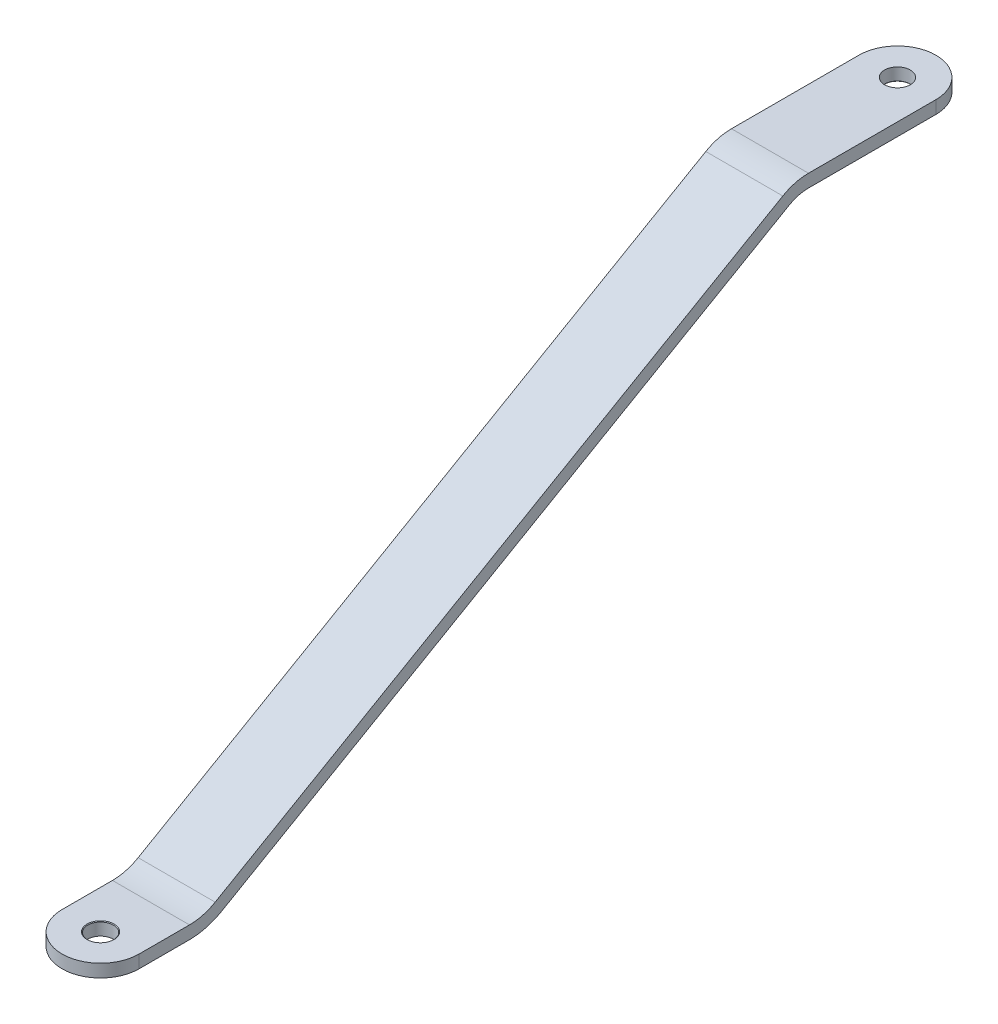
ISO-10303-21;
HEADER;
FILE_DESCRIPTION(('STEP AP214'),'2;1');
FILE_NAME('part.step','',(''),(''),'','','');
FILE_SCHEMA(('AUTOMOTIVE_DESIGN { 1 0 10303 214 1 1 1 1 }'));
ENDSEC;
DATA;
#1=APPLICATION_CONTEXT('core data for automotive mechanical design processes');
#2=APPLICATION_PROTOCOL_DEFINITION('international standard','automotive_design',2000,#1);
#3=PRODUCT_CONTEXT('',#1,'mechanical');
#4=PRODUCT('Part','Part','',(#3));
#5=PRODUCT_RELATED_PRODUCT_CATEGORY('part','',(#4));
#6=PRODUCT_DEFINITION_FORMATION('','',#4);
#7=PRODUCT_DEFINITION_CONTEXT('part definition',#1,'design');
#8=PRODUCT_DEFINITION('design','',#6,#7);
#9=PRODUCT_DEFINITION_SHAPE('','',#8);
#10=(LENGTH_UNIT() NAMED_UNIT(*) SI_UNIT(.MILLI.,.METRE.));
#11=(NAMED_UNIT(*) PLANE_ANGLE_UNIT() SI_UNIT($,.RADIAN.));
#12=(NAMED_UNIT(*) SI_UNIT($,.STERADIAN.) SOLID_ANGLE_UNIT());
#13=UNCERTAINTY_MEASURE_WITH_UNIT(LENGTH_MEASURE(1.E-05),#10,'distance_accuracy_value','');
#14=(GEOMETRIC_REPRESENTATION_CONTEXT(3) GLOBAL_UNCERTAINTY_ASSIGNED_CONTEXT((#13)) GLOBAL_UNIT_ASSIGNED_CONTEXT((#10,
#11,#12)) REPRESENTATION_CONTEXT('',''));
#15=CARTESIAN_POINT('',(0.,0.,0.));
#16=DIRECTION('',(0.,0.,1.));
#17=DIRECTION('',(1.,0.,0.));
#18=AXIS2_PLACEMENT_3D('',#15,#16,#17);
#19=CARTESIAN_POINT('',(76.2,0.,394.160701906459));
#20=DIRECTION('',(0.,-1.,0.));
#21=DIRECTION('',(0.,0.,-1.));
#22=AXIS2_PLACEMENT_3D('',#19,#20,#21);
#23=PLANE('',#22);
#24=DIRECTION('',(0.,0.,1.));
#25=VECTOR('',#24,1.);
#26=CARTESIAN_POINT('',(0.,0.,394.160701906459));
#27=LINE('',#26,#25);
#28=CARTESIAN_POINT('',(0.,0.,306.17252088196));
#29=VERTEX_POINT('',#28);
#30=CARTESIAN_POINT('',(0.,0.,356.060701906459));
#31=VERTEX_POINT('',#30);
#32=EDGE_CURVE('E138',#29,#31,#27,.T.);
#33=ORIENTED_EDGE('',*,*,#32,.T.);
#34=CARTESIAN_POINT('',(38.1,0.,356.060701906459));
#35=DIRECTION('',(0.,-1.,0.));
#36=DIRECTION('',(0.,0.,-1.));
#37=AXIS2_PLACEMENT_3D('',#34,#35,#36);
#38=CIRCLE('',#37,38.1);
#39=CARTESIAN_POINT('',(76.2,0.,356.060701906459));
#40=VERTEX_POINT('',#39);
#41=EDGE_CURVE('E216',#31,#40,#38,.F.);
#42=ORIENTED_EDGE('',*,*,#41,.T.);
#43=DIRECTION('',(0.,0.,1.));
#44=VECTOR('',#43,1.);
#45=CARTESIAN_POINT('',(76.2,0.,394.160701906459));
#46=LINE('',#45,#44);
#47=CARTESIAN_POINT('',(76.2,0.,306.17252088196));
#48=VERTEX_POINT('',#47);
#49=EDGE_CURVE('E173',#48,#40,#46,.T.);
#50=ORIENTED_EDGE('',*,*,#49,.F.);
#51=DIRECTION('',(-1.,0.,0.));
#52=VECTOR('',#51,1.);
#53=CARTESIAN_POINT('',(76.2,0.,306.17252088196));
#54=LINE('',#53,#52);
#55=EDGE_CURVE('E172',#48,#29,#54,.T.);
#56=ORIENTED_EDGE('',*,*,#55,.T.);
#57=EDGE_LOOP('',(#33,#42,#50,#56));
#58=FACE_BOUND('',#57,.T.);
#59=CARTESIAN_POINT('',(38.1,-1.27520573627798E-13,356.060701906459));
#60=DIRECTION('',(0.,1.,0.));
#61=DIRECTION('',(0.,0.,1.));
#62=AXIS2_PLACEMENT_3D('',#59,#60,#61);
#63=CIRCLE('',#62,13.335);
#64=CARTESIAN_POINT('',(38.1,-1.32231439788521E-13,369.395701906459));
#65=VERTEX_POINT('',#64);
#66=EDGE_CURVE('E301',#65,#65,#63,.T.);
#67=ORIENTED_EDGE('',*,*,#66,.F.);
#68=EDGE_LOOP('',(#67));
#69=FACE_BOUND('',#68,.T.);
#70=ADVANCED_FACE('F41',(#58,#69),#23,.F.);
#71=CARTESIAN_POINT('',(38.1,337.820000000001,-432.260701906459));
#72=DIRECTION('',(0.,1.,0.));
#73=DIRECTION('',(0.,0.,1.));
#74=AXIS2_PLACEMENT_3D('',#71,#72,#73);
#75=CYLINDRICAL_SURFACE('',#74,38.1);
#76=DIRECTION('',(0.,1.,0.));
#77=VECTOR('',#76,1.);
#78=CARTESIAN_POINT('',(0.,50.8,-432.260701906459));
#79=LINE('',#78,#77);
#80=CARTESIAN_POINT('',(0.,337.820000000001,-432.260701906459));
#81=VERTEX_POINT('',#80);
#82=CARTESIAN_POINT('',(0.,325.120000000001,-432.260701906459));
#83=VERTEX_POINT('',#82);
#84=EDGE_CURVE('E219',#81,#83,#79,.F.);
#85=ORIENTED_EDGE('',*,*,#84,.F.);
#86=CARTESIAN_POINT('',(38.1,337.820000000001,-432.260701906459));
#87=DIRECTION('',(0.,-1.,0.));
#88=DIRECTION('',(0.,0.,-1.));
#89=AXIS2_PLACEMENT_3D('',#86,#87,#88);
#90=CIRCLE('',#89,38.1);
#91=CARTESIAN_POINT('',(76.2,337.820000000001,-432.260701906459));
#92=VERTEX_POINT('',#91);
#93=EDGE_CURVE('E49',#92,#81,#90,.F.);
#94=ORIENTED_EDGE('',*,*,#93,.F.);
#95=DIRECTION('',(0.,-1.,0.));
#96=VECTOR('',#95,1.);
#97=CARTESIAN_POINT('',(76.2,337.820000000001,-432.260701906459));
#98=LINE('',#97,#96);
#99=CARTESIAN_POINT('',(76.2,325.120000000001,-432.260701906459));
#100=VERTEX_POINT('',#99);
#101=EDGE_CURVE('E224',#100,#92,#98,.F.);
#102=ORIENTED_EDGE('',*,*,#101,.F.);
#103=CARTESIAN_POINT('',(38.1,325.120000000001,-432.260701906459));
#104=DIRECTION('',(0.,1.,0.));
#105=DIRECTION('',(0.,0.,1.));
#106=AXIS2_PLACEMENT_3D('',#103,#104,#105);
#107=CIRCLE('',#106,38.1);
#108=EDGE_CURVE('E11',#83,#100,#107,.F.);
#109=ORIENTED_EDGE('',*,*,#108,.F.);
#110=EDGE_LOOP('',(#85,#94,#102,#109));
#111=FACE_BOUND('',#110,.T.);
#112=ADVANCED_FACE('F42',(#111),#75,.T.);
#113=CARTESIAN_POINT('',(38.1,0.,356.060701906459));
#114=DIRECTION('',(0.,-1.,0.));
#115=DIRECTION('',(0.,0.,-1.));
#116=AXIS2_PLACEMENT_3D('',#113,#114,#115);
#117=CYLINDRICAL_SURFACE('',#116,38.1);
#118=DIRECTION('',(0.,1.,0.));
#119=VECTOR('',#118,1.);
#120=CARTESIAN_POINT('',(76.2,0.,356.060701906459));
#121=LINE('',#120,#119);
#122=CARTESIAN_POINT('',(76.2,-12.7,356.060701906459));
#123=VERTEX_POINT('',#122);
#124=EDGE_CURVE('E139',#40,#123,#121,.F.);
#125=ORIENTED_EDGE('',*,*,#124,.F.);
#126=ORIENTED_EDGE('',*,*,#41,.F.);
#127=DIRECTION('',(0.,-1.,0.));
#128=VECTOR('',#127,1.);
#129=CARTESIAN_POINT('',(0.,50.8,356.060701906459));
#130=LINE('',#129,#128);
#131=CARTESIAN_POINT('',(0.,-12.7,356.060701906459));
#132=VERTEX_POINT('',#131);
#133=EDGE_CURVE('E213',#132,#31,#130,.F.);
#134=ORIENTED_EDGE('',*,*,#133,.F.);
#135=CARTESIAN_POINT('',(38.1,-12.7,356.060701906459));
#136=DIRECTION('',(0.,1.,0.));
#137=DIRECTION('',(0.,0.,1.));
#138=AXIS2_PLACEMENT_3D('',#135,#136,#137);
#139=CIRCLE('',#138,38.1);
#140=EDGE_CURVE('E217',#123,#132,#139,.F.);
#141=ORIENTED_EDGE('',*,*,#140,.F.);
#142=EDGE_LOOP('',(#125,#126,#134,#141));
#143=FACE_BOUND('',#142,.T.);
#144=ADVANCED_FACE('F271',(#143),#117,.T.);
#145=CARTESIAN_POINT('',(76.2,-12.7,394.160701906459));
#146=DIRECTION('',(0.,1.,0.));
#147=DIRECTION('',(0.,0.,1.));
#148=AXIS2_PLACEMENT_3D('',#145,#146,#147);
#149=PLANE('',#148);
#150=CARTESIAN_POINT('',(38.1,-12.7000000000002,356.060701906459));
#151=DIRECTION('',(0.,1.,0.));
#152=DIRECTION('',(0.,0.,1.));
#153=AXIS2_PLACEMENT_3D('',#150,#151,#152);
#154=CIRCLE('',#153,12.7);
#155=CARTESIAN_POINT('',(38.1,-12.7000000000003,368.760701906459));
#156=VERTEX_POINT('',#155);
#157=EDGE_CURVE('E177',#156,#156,#154,.T.);
#158=ORIENTED_EDGE('',*,*,#157,.T.);
#159=EDGE_LOOP('',(#158));
#160=FACE_BOUND('',#159,.T.);
#161=DIRECTION('',(0.,0.,-1.));
#162=VECTOR('',#161,1.);
#163=CARTESIAN_POINT('',(76.2,-12.7,394.160701906459));
#164=LINE('',#163,#162);
#165=CARTESIAN_POINT('',(76.2,-12.7,306.17252088196));
#166=VERTEX_POINT('',#165);
#167=EDGE_CURVE('E129',#123,#166,#164,.T.);
#168=ORIENTED_EDGE('',*,*,#167,.F.);
#169=ORIENTED_EDGE('',*,*,#140,.T.);
#170=DIRECTION('',(0.,0.,-1.));
#171=VECTOR('',#170,1.);
#172=CARTESIAN_POINT('',(0.,-12.7,394.160701906459));
#173=LINE('',#172,#171);
#174=CARTESIAN_POINT('',(0.,-12.7,306.17252088196));
#175=VERTEX_POINT('',#174);
#176=EDGE_CURVE('E148',#132,#175,#173,.T.);
#177=ORIENTED_EDGE('',*,*,#176,.T.);
#178=DIRECTION('',(-1.,0.,0.));
#179=VECTOR('',#178,1.);
#180=CARTESIAN_POINT('',(76.2,-12.7,306.17252088196));
#181=LINE('',#180,#179);
#182=EDGE_CURVE('E141',#166,#175,#181,.T.);
#183=ORIENTED_EDGE('',*,*,#182,.F.);
#184=EDGE_LOOP('',(#168,#169,#177,#183));
#185=FACE_BOUND('',#184,.T.);
#186=ADVANCED_FACE('F145',(#160,#185),#149,.F.);
#187=CARTESIAN_POINT('',(76.2,50.8,306.17252088196));
#188=DIRECTION('',(-1.,0.,0.));
#189=DIRECTION('',(0.,0.,1.));
#190=AXIS2_PLACEMENT_3D('',#187,#188,#189);
#191=CYLINDRICAL_SURFACE('',#190,63.5);
#192=CARTESIAN_POINT('',(0.,50.8,306.17252088196));
#193=DIRECTION('',(1.,0.,0.));
#194=DIRECTION('',(0.,0.,-1.));
#195=AXIS2_PLACEMENT_3D('',#192,#193,#194);
#196=CIRCLE('',#195,63.5);
#197=CARTESIAN_POINT('',(0.,-4.19261314031182,274.42252088196));
#198=VERTEX_POINT('',#197);
#199=EDGE_CURVE('E171',#175,#198,#196,.T.);
#200=ORIENTED_EDGE('',*,*,#199,.T.);
#201=DIRECTION('',(-1.,0.,0.));
#202=VECTOR('',#201,1.);
#203=CARTESIAN_POINT('',(76.2,-4.19261314031182,274.42252088196));
#204=LINE('',#203,#202);
#205=CARTESIAN_POINT('',(76.2,-4.19261314031182,274.42252088196));
#206=VERTEX_POINT('',#205);
#207=EDGE_CURVE('E149',#206,#198,#204,.T.);
#208=ORIENTED_EDGE('',*,*,#207,.F.);
#209=CARTESIAN_POINT('',(76.2,50.8,306.17252088196));
#210=DIRECTION('',(1.,0.,0.));
#211=DIRECTION('',(0.,0.,-1.));
#212=AXIS2_PLACEMENT_3D('',#209,#210,#211);
#213=CIRCLE('',#212,63.5);
#214=EDGE_CURVE('E135',#166,#206,#213,.T.);
#215=ORIENTED_EDGE('',*,*,#214,.F.);
#216=ORIENTED_EDGE('',*,*,#182,.T.);
#217=EDGE_LOOP('',(#200,#208,#215,#216));
#218=FACE_BOUND('',#217,.T.);
#219=ADVANCED_FACE('F151',(#218),#191,.T.);
#220=CARTESIAN_POINT('',(76.2,-4.19261314031182,274.42252088196));
#221=DIRECTION('',(0.,0.866025403784438,0.500000000000001));
#222=DIRECTION('',(0.,-0.500000000000001,0.866025403784438));
#223=AXIS2_PLACEMENT_3D('',#220,#221,#222);
#224=PLANE('',#223);
#225=DIRECTION('',(0.,0.500000000000001,-0.866025403784438));
#226=VECTOR('',#225,1.);
#227=CARTESIAN_POINT('',(0.,-4.19261314031182,274.42252088196));
#228=LINE('',#227,#226);
#229=CARTESIAN_POINT('',(0.,320.015567884188,-287.12252088196));
#230=VERTEX_POINT('',#229);
#231=EDGE_CURVE('E179',#198,#230,#228,.T.);
#232=ORIENTED_EDGE('',*,*,#231,.T.);
#233=DIRECTION('',(-1.,0.,0.));
#234=VECTOR('',#233,1.);
#235=CARTESIAN_POINT('',(76.2,320.015567884188,-287.12252088196));
#236=LINE('',#235,#234);
#237=CARTESIAN_POINT('',(76.2,320.015567884188,-287.12252088196));
#238=VERTEX_POINT('',#237);
#239=EDGE_CURVE('E208',#238,#230,#236,.T.);
#240=ORIENTED_EDGE('',*,*,#239,.F.);
#241=DIRECTION('',(0.,0.500000000000001,-0.866025403784438));
#242=VECTOR('',#241,1.);
#243=CARTESIAN_POINT('',(76.2,-4.19261314031182,274.42252088196));
#244=LINE('',#243,#242);
#245=EDGE_CURVE('E152',#206,#238,#244,.T.);
#246=ORIENTED_EDGE('',*,*,#245,.F.);
#247=ORIENTED_EDGE('',*,*,#207,.T.);
#248=EDGE_LOOP('',(#232,#240,#246,#247));
#249=FACE_BOUND('',#248,.T.);
#250=ADVANCED_FACE('F255',(#249),#224,.F.);
#251=CARTESIAN_POINT('',(76.2,287.020000000001,-306.17252088196));
#252=DIRECTION('',(-1.,0.,0.));
#253=DIRECTION('',(0.,0.,1.));
#254=AXIS2_PLACEMENT_3D('',#251,#252,#253);
#255=CYLINDRICAL_SURFACE('',#254,38.1);
#256=CARTESIAN_POINT('',(0.,287.020000000001,-306.17252088196));
#257=DIRECTION('',(-1.,0.,0.));
#258=DIRECTION('',(0.,0.,1.));
#259=AXIS2_PLACEMENT_3D('',#256,#257,#258);
#260=CIRCLE('',#259,38.1);
#261=CARTESIAN_POINT('',(0.,325.120000000001,-306.17252088196));
#262=VERTEX_POINT('',#261);
#263=EDGE_CURVE('E178',#230,#262,#260,.T.);
#264=ORIENTED_EDGE('',*,*,#263,.T.);
#265=DIRECTION('',(-1.,0.,0.));
#266=VECTOR('',#265,1.);
#267=CARTESIAN_POINT('',(76.2,325.120000000001,-306.17252088196));
#268=LINE('',#267,#266);
#269=CARTESIAN_POINT('',(76.2,325.120000000001,-306.17252088196));
#270=VERTEX_POINT('',#269);
#271=EDGE_CURVE('E202',#270,#262,#268,.T.);
#272=ORIENTED_EDGE('',*,*,#271,.F.);
#273=CARTESIAN_POINT('',(76.2,287.020000000001,-306.17252088196));
#274=DIRECTION('',(-1.,0.,0.));
#275=DIRECTION('',(0.,0.,1.));
#276=AXIS2_PLACEMENT_3D('',#273,#274,#275);
#277=CIRCLE('',#276,38.1);
#278=EDGE_CURVE('E156',#238,#270,#277,.T.);
#279=ORIENTED_EDGE('',*,*,#278,.F.);
#280=ORIENTED_EDGE('',*,*,#239,.T.);
#281=EDGE_LOOP('',(#264,#272,#279,#280));
#282=FACE_BOUND('',#281,.T.);
#283=ADVANCED_FACE('F253',(#282),#255,.F.);
#284=CARTESIAN_POINT('',(76.2,325.120000000001,-306.17252088196));
#285=DIRECTION('',(0.,1.,0.));
#286=DIRECTION('',(0.,0.,1.));
#287=AXIS2_PLACEMENT_3D('',#284,#285,#286);
#288=PLANE('',#287);
#289=CARTESIAN_POINT('',(38.1,325.120000000001,-432.260701906459));
#290=DIRECTION('',(0.,-1.,0.));
#291=DIRECTION('',(0.,0.,-1.));
#292=AXIS2_PLACEMENT_3D('',#289,#290,#291);
#293=CIRCLE('',#292,13.335);
#294=CARTESIAN_POINT('',(38.1,325.120000000001,-445.595701906459));
#295=VERTEX_POINT('',#294);
#296=EDGE_CURVE('E294',#295,#295,#293,.T.);
#297=ORIENTED_EDGE('',*,*,#296,.F.);
#298=EDGE_LOOP('',(#297));
#299=FACE_BOUND('',#298,.T.);
#300=DIRECTION('',(0.,0.,-1.));
#301=VECTOR('',#300,1.);
#302=CARTESIAN_POINT('',(0.,325.120000000001,-306.17252088196));
#303=LINE('',#302,#301);
#304=EDGE_CURVE('E185',#262,#83,#303,.T.);
#305=ORIENTED_EDGE('',*,*,#304,.T.);
#306=ORIENTED_EDGE('',*,*,#108,.T.);
#307=DIRECTION('',(0.,0.,-1.));
#308=VECTOR('',#307,1.);
#309=CARTESIAN_POINT('',(76.2,325.120000000001,-306.17252088196));
#310=LINE('',#309,#308);
#311=EDGE_CURVE('E161',#270,#100,#310,.T.);
#312=ORIENTED_EDGE('',*,*,#311,.F.);
#313=ORIENTED_EDGE('',*,*,#271,.T.);
#314=EDGE_LOOP('',(#305,#306,#312,#313));
#315=FACE_BOUND('',#314,.T.);
#316=ADVANCED_FACE('F250',(#299,#315),#288,.F.);
#317=CARTESIAN_POINT('',(76.2,337.820000000001,-306.17252088196));
#318=DIRECTION('',(0.,-1.,0.));
#319=DIRECTION('',(0.,0.,-1.));
#320=AXIS2_PLACEMENT_3D('',#317,#318,#319);
#321=PLANE('',#320);
#322=CARTESIAN_POINT('',(38.1,337.820000000001,-432.260701906459));
#323=DIRECTION('',(0.,-1.,0.));
#324=DIRECTION('',(0.,0.,-1.));
#325=AXIS2_PLACEMENT_3D('',#322,#323,#324);
#326=CIRCLE('',#325,12.7);
#327=CARTESIAN_POINT('',(38.1,337.820000000001,-444.960701906459));
#328=VERTEX_POINT('',#327);
#329=EDGE_CURVE('E300',#328,#328,#326,.T.);
#330=ORIENTED_EDGE('',*,*,#329,.T.);
#331=EDGE_LOOP('',(#330));
#332=FACE_BOUND('',#331,.T.);
#333=DIRECTION('',(0.,0.,1.));
#334=VECTOR('',#333,1.);
#335=CARTESIAN_POINT('',(76.2,337.820000000001,-306.17252088196));
#336=LINE('',#335,#334);
#337=CARTESIAN_POINT('',(76.2,337.820000000001,-306.17252088196));
#338=VERTEX_POINT('',#337);
#339=EDGE_CURVE('E162',#92,#338,#336,.T.);
#340=ORIENTED_EDGE('',*,*,#339,.F.);
#341=ORIENTED_EDGE('',*,*,#93,.T.);
#342=DIRECTION('',(0.,0.,1.));
#343=VECTOR('',#342,1.);
#344=CARTESIAN_POINT('',(0.,337.820000000001,-306.17252088196));
#345=LINE('',#344,#343);
#346=CARTESIAN_POINT('',(0.,337.820000000001,-306.17252088196));
#347=VERTEX_POINT('',#346);
#348=EDGE_CURVE('E184',#81,#347,#345,.T.);
#349=ORIENTED_EDGE('',*,*,#348,.T.);
#350=DIRECTION('',(-1.,0.,0.));
#351=VECTOR('',#350,1.);
#352=CARTESIAN_POINT('',(76.2,337.820000000001,-306.17252088196));
#353=LINE('',#352,#351);
#354=EDGE_CURVE('E205',#338,#347,#353,.T.);
#355=ORIENTED_EDGE('',*,*,#354,.F.);
#356=EDGE_LOOP('',(#340,#341,#349,#355));
#357=FACE_BOUND('',#356,.T.);
#358=ADVANCED_FACE('F228',(#332,#357),#321,.F.);
#359=CARTESIAN_POINT('',(76.2,287.020000000001,-306.17252088196));
#360=DIRECTION('',(-1.,0.,0.));
#361=DIRECTION('',(0.,0.,1.));
#362=AXIS2_PLACEMENT_3D('',#359,#360,#361);
#363=CYLINDRICAL_SURFACE('',#362,50.8);
#364=CARTESIAN_POINT('',(0.,287.020000000001,-306.17252088196));
#365=DIRECTION('',(1.,0.,0.));
#366=DIRECTION('',(0.,0.,1.));
#367=AXIS2_PLACEMENT_3D('',#364,#365,#366);
#368=CIRCLE('',#367,50.8);
#369=CARTESIAN_POINT('',(0.,331.01409051225,-280.77252088196));
#370=VERTEX_POINT('',#369);
#371=EDGE_CURVE('E188',#347,#370,#368,.T.);
#372=ORIENTED_EDGE('',*,*,#371,.T.);
#373=DIRECTION('',(-1.,0.,0.));
#374=VECTOR('',#373,1.);
#375=CARTESIAN_POINT('',(76.2,331.01409051225,-280.77252088196));
#376=LINE('',#375,#374);
#377=CARTESIAN_POINT('',(76.2,331.01409051225,-280.77252088196));
#378=VERTEX_POINT('',#377);
#379=EDGE_CURVE('E200',#378,#370,#376,.T.);
#380=ORIENTED_EDGE('',*,*,#379,.F.);
#381=CARTESIAN_POINT('',(76.2,287.020000000001,-306.17252088196));
#382=DIRECTION('',(1.,0.,0.));
#383=DIRECTION('',(0.,0.,1.));
#384=AXIS2_PLACEMENT_3D('',#381,#382,#383);
#385=CIRCLE('',#384,50.8);
#386=EDGE_CURVE('E164',#338,#378,#385,.T.);
#387=ORIENTED_EDGE('',*,*,#386,.F.);
#388=ORIENTED_EDGE('',*,*,#354,.T.);
#389=EDGE_LOOP('',(#372,#380,#387,#388));
#390=FACE_BOUND('',#389,.T.);
#391=ADVANCED_FACE('F240',(#390),#363,.T.);
#392=CARTESIAN_POINT('',(76.2,6.80590948775053,280.77252088196));
#393=DIRECTION('',(0.,-0.866025403784438,-0.500000000000001));
#394=DIRECTION('',(0.,0.500000000000002,-0.866025403784438));
#395=AXIS2_PLACEMENT_3D('',#392,#393,#394);
#396=PLANE('',#395);
#397=DIRECTION('',(0.,-0.500000000000001,0.866025403784438));
#398=VECTOR('',#397,1.);
#399=CARTESIAN_POINT('',(0.,6.80590948775053,280.77252088196));
#400=LINE('',#399,#398);
#401=CARTESIAN_POINT('',(0.,6.80590948775054,280.77252088196));
#402=VERTEX_POINT('',#401);
#403=EDGE_CURVE('E187',#370,#402,#400,.T.);
#404=ORIENTED_EDGE('',*,*,#403,.T.);
#405=DIRECTION('',(-1.,0.,0.));
#406=VECTOR('',#405,1.);
#407=CARTESIAN_POINT('',(76.2,6.80590948775054,280.77252088196));
#408=LINE('',#407,#406);
#409=CARTESIAN_POINT('',(76.2,6.80590948775054,280.77252088196));
#410=VERTEX_POINT('',#409);
#411=EDGE_CURVE('E198',#410,#402,#408,.T.);
#412=ORIENTED_EDGE('',*,*,#411,.F.);
#413=DIRECTION('',(0.,-0.500000000000001,0.866025403784438));
#414=VECTOR('',#413,1.);
#415=CARTESIAN_POINT('',(76.2,6.80590948775053,280.77252088196));
#416=LINE('',#415,#414);
#417=EDGE_CURVE('E170',#378,#410,#416,.T.);
#418=ORIENTED_EDGE('',*,*,#417,.F.);
#419=ORIENTED_EDGE('',*,*,#379,.T.);
#420=EDGE_LOOP('',(#404,#412,#418,#419));
#421=FACE_BOUND('',#420,.T.);
#422=ADVANCED_FACE('F243',(#421),#396,.F.);
#423=CARTESIAN_POINT('',(76.2,50.8,306.17252088196));
#424=DIRECTION('',(-1.,0.,0.));
#425=DIRECTION('',(0.,0.,1.));
#426=AXIS2_PLACEMENT_3D('',#423,#424,#425);
#427=CYLINDRICAL_SURFACE('',#426,50.8);
#428=CARTESIAN_POINT('',(0.,50.8,306.17252088196));
#429=DIRECTION('',(-1.,0.,0.));
#430=DIRECTION('',(0.,0.,-1.));
#431=AXIS2_PLACEMENT_3D('',#428,#429,#430);
#432=CIRCLE('',#431,50.8);
#433=EDGE_CURVE('E186',#402,#29,#432,.T.);
#434=ORIENTED_EDGE('',*,*,#433,.T.);
#435=ORIENTED_EDGE('',*,*,#55,.F.);
#436=CARTESIAN_POINT('',(76.2,50.8,306.17252088196));
#437=DIRECTION('',(-1.,0.,0.));
#438=DIRECTION('',(0.,0.,-1.));
#439=AXIS2_PLACEMENT_3D('',#436,#437,#438);
#440=CIRCLE('',#439,50.8);
#441=EDGE_CURVE('E166',#410,#48,#440,.T.);
#442=ORIENTED_EDGE('',*,*,#441,.F.);
#443=ORIENTED_EDGE('',*,*,#411,.T.);
#444=EDGE_LOOP('',(#434,#435,#442,#443));
#445=FACE_BOUND('',#444,.T.);
#446=ADVANCED_FACE('F277',(#445),#427,.F.);
#447=CARTESIAN_POINT('',(76.2,50.8,306.17252088196));
#448=DIRECTION('',(1.,0.,0.));
#449=DIRECTION('',(0.,0.,-1.));
#450=AXIS2_PLACEMENT_3D('',#447,#448,#449);
#451=PLANE('',#450);
#452=ORIENTED_EDGE('',*,*,#311,.T.);
#453=ORIENTED_EDGE('',*,*,#101,.T.);
#454=ORIENTED_EDGE('',*,*,#339,.T.);
#455=ORIENTED_EDGE('',*,*,#386,.T.);
#456=ORIENTED_EDGE('',*,*,#417,.T.);
#457=ORIENTED_EDGE('',*,*,#441,.T.);
#458=ORIENTED_EDGE('',*,*,#49,.T.);
#459=ORIENTED_EDGE('',*,*,#124,.T.);
#460=ORIENTED_EDGE('',*,*,#167,.T.);
#461=ORIENTED_EDGE('',*,*,#214,.T.);
#462=ORIENTED_EDGE('',*,*,#245,.T.);
#463=ORIENTED_EDGE('',*,*,#278,.T.);
#464=EDGE_LOOP('',(#452,#453,#454,#455,#456,#457,#458,#459,#460,#461,#462,#463));
#465=FACE_BOUND('',#464,.T.);
#466=ADVANCED_FACE('F134',(#465),#451,.T.);
#467=CARTESIAN_POINT('',(0.,50.8,306.17252088196));
#468=DIRECTION('',(1.,0.,0.));
#469=DIRECTION('',(0.,0.,-1.));
#470=AXIS2_PLACEMENT_3D('',#467,#468,#469);
#471=PLANE('',#470);
#472=ORIENTED_EDGE('',*,*,#348,.F.);
#473=ORIENTED_EDGE('',*,*,#84,.T.);
#474=ORIENTED_EDGE('',*,*,#304,.F.);
#475=ORIENTED_EDGE('',*,*,#263,.F.);
#476=ORIENTED_EDGE('',*,*,#231,.F.);
#477=ORIENTED_EDGE('',*,*,#199,.F.);
#478=ORIENTED_EDGE('',*,*,#176,.F.);
#479=ORIENTED_EDGE('',*,*,#133,.T.);
#480=ORIENTED_EDGE('',*,*,#32,.F.);
#481=ORIENTED_EDGE('',*,*,#433,.F.);
#482=ORIENTED_EDGE('',*,*,#403,.F.);
#483=ORIENTED_EDGE('',*,*,#371,.F.);
#484=EDGE_LOOP('',(#472,#473,#474,#475,#476,#477,#478,#479,#480,#481,#482,#483));
#485=FACE_BOUND('',#484,.T.);
#486=ADVANCED_FACE('F235',(#485),#471,.F.);
#487=CARTESIAN_POINT('',(38.1,-1.25785850151821E-13,356.060701906459));
#488=DIRECTION('',(0.,1.,0.));
#489=DIRECTION('',(0.,0.,1.));
#490=AXIS2_PLACEMENT_3D('',#487,#488,#489);
#491=CYLINDRICAL_SURFACE('',#490,12.7);
#492=ORIENTED_EDGE('',*,*,#157,.F.);
#493=EDGE_LOOP('',(#492));
#494=FACE_BOUND('',#493,.T.);
#495=CARTESIAN_POINT('',(38.1,-0.635000000000124,356.060701906459));
#496=DIRECTION('',(0.,1.,0.));
#497=DIRECTION('',(0.,0.,1.));
#498=AXIS2_PLACEMENT_3D('',#495,#496,#497);
#499=CIRCLE('',#498,12.7);
#500=CARTESIAN_POINT('',(38.1,-0.635000000000129,368.760701906459));
#501=VERTEX_POINT('',#500);
#502=EDGE_CURVE('E307',#501,#501,#499,.T.);
#503=ORIENTED_EDGE('',*,*,#502,.T.);
#504=EDGE_LOOP('',(#503));
#505=FACE_BOUND('',#504,.T.);
#506=ADVANCED_FACE('F311',(#494,#505),#491,.F.);
#507=CARTESIAN_POINT('',(38.1,-1.27520573627798E-13,356.060701906459));
#508=DIRECTION('',(0.,1.,0.));
#509=DIRECTION('',(0.,0.,1.));
#510=AXIS2_PLACEMENT_3D('',#507,#508,#509);
#511=CONICAL_SURFACE('',#510,13.335,0.785398163397454);
#512=ORIENTED_EDGE('',*,*,#502,.F.);
#513=EDGE_LOOP('',(#512));
#514=FACE_BOUND('',#513,.T.);
#515=ORIENTED_EDGE('',*,*,#66,.T.);
#516=EDGE_LOOP('',(#515));
#517=FACE_BOUND('',#516,.T.);
#518=ADVANCED_FACE('F316',(#514,#517),#511,.F.);
#519=CARTESIAN_POINT('',(38.1,325.120000000001,-432.260701906459));
#520=DIRECTION('',(0.,-1.,0.));
#521=DIRECTION('',(0.,0.,-1.));
#522=AXIS2_PLACEMENT_3D('',#519,#520,#521);
#523=CYLINDRICAL_SURFACE('',#522,12.7);
#524=ORIENTED_EDGE('',*,*,#329,.F.);
#525=EDGE_LOOP('',(#524));
#526=FACE_BOUND('',#525,.T.);
#527=CARTESIAN_POINT('',(38.1,325.755000000001,-432.260701906459));
#528=DIRECTION('',(0.,-1.,0.));
#529=DIRECTION('',(0.,0.,-1.));
#530=AXIS2_PLACEMENT_3D('',#527,#528,#529);
#531=CIRCLE('',#530,12.7);
#532=CARTESIAN_POINT('',(38.1,325.755000000001,-444.960701906459));
#533=VERTEX_POINT('',#532);
#534=EDGE_CURVE('E298',#533,#533,#531,.T.);
#535=ORIENTED_EDGE('',*,*,#534,.T.);
#536=EDGE_LOOP('',(#535));
#537=FACE_BOUND('',#536,.T.);
#538=ADVANCED_FACE('F321',(#526,#537),#523,.F.);
#539=CARTESIAN_POINT('',(38.1,325.120000000001,-432.260701906459));
#540=DIRECTION('',(0.,-1.,0.));
#541=DIRECTION('',(0.,0.,-1.));
#542=AXIS2_PLACEMENT_3D('',#539,#540,#541);
#543=CONICAL_SURFACE('',#542,13.335,0.785398163397454);
#544=ORIENTED_EDGE('',*,*,#534,.F.);
#545=EDGE_LOOP('',(#544));
#546=FACE_BOUND('',#545,.T.);
#547=ORIENTED_EDGE('',*,*,#296,.T.);
#548=EDGE_LOOP('',(#547));
#549=FACE_BOUND('',#548,.T.);
#550=ADVANCED_FACE('F330',(#546,#549),#543,.F.);
#551=CLOSED_SHELL('',(#70,#112,#144,#186,#219,#250,#283,#316,#358,#391,#422,#446,#466,#486,#506,
#518,#538,#550));
#552=MANIFOLD_SOLID_BREP('B2',#551);
#553=ADVANCED_BREP_SHAPE_REPRESENTATION('',(#18,#552),#14);
#554=SHAPE_DEFINITION_REPRESENTATION(#9,#553);
ENDSEC;
END-ISO-10303-21;
